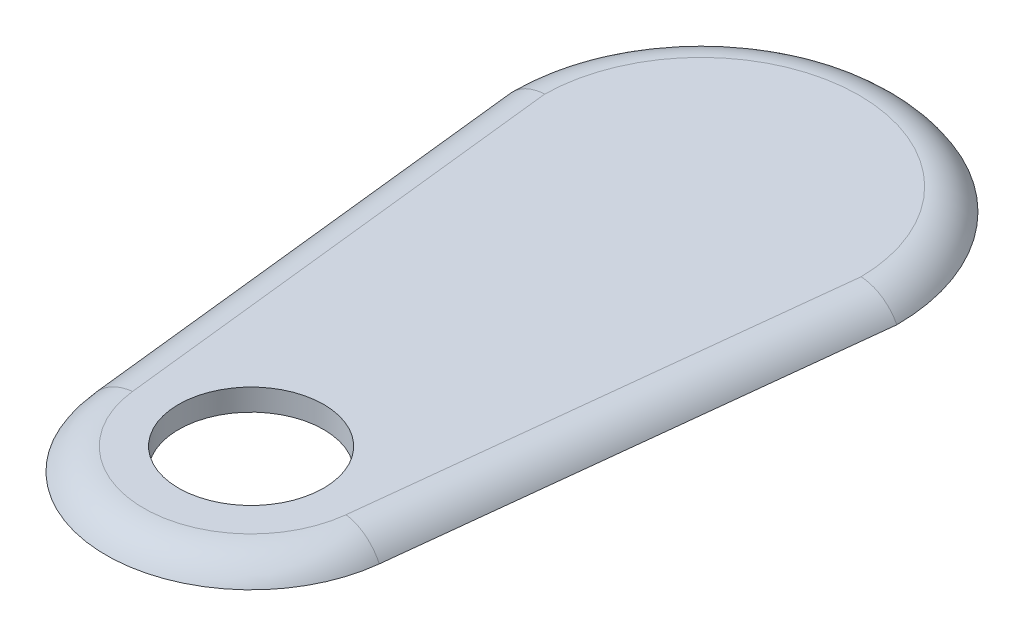
ISO-10303-21;
HEADER;
FILE_DESCRIPTION(('STEP AP214'),'2;1');
FILE_NAME('part.step','',(''),(''),'','','');
FILE_SCHEMA(('AUTOMOTIVE_DESIGN { 1 0 10303 214 1 1 1 1 }'));
ENDSEC;
DATA;
#1=APPLICATION_CONTEXT('core data for automotive mechanical design processes');
#2=APPLICATION_PROTOCOL_DEFINITION('international standard','automotive_design',2000,#1);
#3=PRODUCT_CONTEXT('',#1,'mechanical');
#4=PRODUCT('Part','Part','',(#3));
#5=PRODUCT_RELATED_PRODUCT_CATEGORY('part','',(#4));
#6=PRODUCT_DEFINITION_FORMATION('','',#4);
#7=PRODUCT_DEFINITION_CONTEXT('part definition',#1,'design');
#8=PRODUCT_DEFINITION('design','',#6,#7);
#9=PRODUCT_DEFINITION_SHAPE('','',#8);
#10=(LENGTH_UNIT() NAMED_UNIT(*) SI_UNIT(.MILLI.,.METRE.));
#11=(NAMED_UNIT(*) PLANE_ANGLE_UNIT() SI_UNIT($,.RADIAN.));
#12=(NAMED_UNIT(*) SI_UNIT($,.STERADIAN.) SOLID_ANGLE_UNIT());
#13=UNCERTAINTY_MEASURE_WITH_UNIT(LENGTH_MEASURE(1.E-05),#10,'distance_accuracy_value','');
#14=(GEOMETRIC_REPRESENTATION_CONTEXT(3) GLOBAL_UNCERTAINTY_ASSIGNED_CONTEXT((#13)) GLOBAL_UNIT_ASSIGNED_CONTEXT((#10,
#11,#12)) REPRESENTATION_CONTEXT('',''));
#15=CARTESIAN_POINT('',(0.,0.,0.));
#16=DIRECTION('',(0.,0.,1.));
#17=DIRECTION('',(1.,0.,0.));
#18=AXIS2_PLACEMENT_3D('',#15,#16,#17);
#19=CARTESIAN_POINT('',(0.,48.36,62.));
#20=DIRECTION('',(0.,1.,0.));
#21=DIRECTION('',(0.,0.,1.));
#22=AXIS2_PLACEMENT_3D('',#19,#20,#21);
#23=PLANE('',#22);
#24=CARTESIAN_POINT('',(0.,48.36,62.));
#25=DIRECTION('',(0.,1.,0.));
#26=DIRECTION('',(0.,0.,1.));
#27=AXIS2_PLACEMENT_3D('',#24,#25,#26);
#28=CIRCLE('',#27,10.);
#29=CARTESIAN_POINT('',(0.,48.36,72.));
#30=VERTEX_POINT('',#29);
#31=EDGE_CURVE('E205',#30,#30,#28,.T.);
#32=ORIENTED_EDGE('',*,*,#31,.F.);
#33=EDGE_LOOP('',(#32));
#34=FACE_BOUND('',#33,.T.);
#35=CARTESIAN_POINT('',(0.,48.36,0.));
#36=DIRECTION('',(0.,1.,0.));
#37=DIRECTION('',(0.,0.,1.));
#38=AXIS2_PLACEMENT_3D('',#35,#36,#37);
#39=CIRCLE('',#38,21.8038475772934);
#40=CARTESIAN_POINT('',(21.8021509086281,48.36,-0.272001711845437));
#41=VERTEX_POINT('',#40);
#42=CARTESIAN_POINT('',(-21.8021509086281,48.36,-0.272001711845434));
#43=VERTEX_POINT('',#42);
#44=EDGE_CURVE('E196',#41,#43,#39,.T.);
#45=ORIENTED_EDGE('',*,*,#44,.T.);
#46=DIRECTION('',(0.110244038447533,0.,0.993904548730299));
#47=VECTOR('',#46,1.);
#48=CARTESIAN_POINT('',(-14.7139020952481,48.36,63.632068180364));
#49=LINE('',#48,#47);
#50=CARTESIAN_POINT('',(-14.7139020952481,48.36,63.632068180364));
#51=VERTEX_POINT('',#50);
#52=EDGE_CURVE('E12',#43,#51,#49,.T.);
#53=ORIENTED_EDGE('',*,*,#52,.T.);
#54=CARTESIAN_POINT('',(0.,48.36,62.));
#55=DIRECTION('',(0.,1.,0.));
#56=DIRECTION('',(0.,0.,1.));
#57=AXIS2_PLACEMENT_3D('',#54,#55,#56);
#58=CIRCLE('',#57,14.8041400092644);
#59=CARTESIAN_POINT('',(14.7139020952481,48.36,63.632068180364));
#60=VERTEX_POINT('',#59);
#61=EDGE_CURVE('E136',#51,#60,#58,.T.);
#62=ORIENTED_EDGE('',*,*,#61,.T.);
#63=DIRECTION('',(-0.110244038447533,0.,0.993904548730299));
#64=VECTOR('',#63,1.);
#65=CARTESIAN_POINT('',(21.8355204711759,48.36,-0.572844827468108));
#66=LINE('',#65,#64);
#67=EDGE_CURVE('E184',#60,#41,#66,.F.);
#68=ORIENTED_EDGE('',*,*,#67,.T.);
#69=EDGE_LOOP('',(#45,#53,#62,#68));
#70=FACE_BOUND('',#69,.T.);
#71=ADVANCED_FACE('F120',(#34,#70),#23,.T.);
#72=CARTESIAN_POINT('',(0.,45.36,62.));
#73=DIRECTION('',(0.,1.,0.));
#74=DIRECTION('',(0.,0.,1.));
#75=AXIS2_PLACEMENT_3D('',#72,#73,#74);
#76=PLANE('',#75);
#77=CARTESIAN_POINT('',(0.,45.36,62.));
#78=DIRECTION('',(0.,-1.,0.));
#79=DIRECTION('',(0.,0.,-1.));
#80=AXIS2_PLACEMENT_3D('',#77,#78,#79);
#81=CIRCLE('',#80,10.);
#82=CARTESIAN_POINT('',(0.,45.36,52.));
#83=VERTEX_POINT('',#82);
#84=EDGE_CURVE('E241',#83,#83,#81,.T.);
#85=ORIENTED_EDGE('',*,*,#84,.F.);
#86=EDGE_LOOP('',(#85));
#87=FACE_BOUND('',#86,.T.);
#88=CARTESIAN_POINT('',(0.,45.36,0.));
#89=DIRECTION('',(0.,1.,0.));
#90=DIRECTION('',(0.,0.,1.));
#91=AXIS2_PLACEMENT_3D('',#88,#89,#90);
#92=CIRCLE('',#91,27.);
#93=CARTESIAN_POINT('',(-27.,45.36,0.));
#94=VERTEX_POINT('',#93);
#95=CARTESIAN_POINT('',(27.,45.36,0.));
#96=VERTEX_POINT('',#95);
#97=EDGE_CURVE('E176',#94,#96,#92,.F.);
#98=ORIENTED_EDGE('',*,*,#97,.T.);
#99=DIRECTION('',(-0.110244038447533,0.,0.993904548730299));
#100=VECTOR('',#99,1.);
#101=CARTESIAN_POINT('',(27.,45.36,0.));
#102=LINE('',#101,#100);
#103=CARTESIAN_POINT('',(19.8783816240722,45.36,64.2049130078321));
#104=VERTEX_POINT('',#103);
#105=EDGE_CURVE('E169',#96,#104,#102,.T.);
#106=ORIENTED_EDGE('',*,*,#105,.T.);
#107=CARTESIAN_POINT('',(0.,45.36,62.));
#108=DIRECTION('',(0.,1.,0.));
#109=DIRECTION('',(0.,0.,1.));
#110=AXIS2_PLACEMENT_3D('',#107,#108,#109);
#111=CIRCLE('',#110,20.000292431971);
#112=CARTESIAN_POINT('',(-19.8783816240722,45.36,64.2049130078321));
#113=VERTEX_POINT('',#112);
#114=EDGE_CURVE('E174',#104,#113,#111,.F.);
#115=ORIENTED_EDGE('',*,*,#114,.T.);
#116=DIRECTION('',(-0.110244038447533,0.,-0.993904548730299));
#117=VECTOR('',#116,1.);
#118=CARTESIAN_POINT('',(-19.8783816240722,45.36,64.2049130078321));
#119=LINE('',#118,#117);
#120=EDGE_CURVE('E190',#113,#94,#119,.T.);
#121=ORIENTED_EDGE('',*,*,#120,.T.);
#122=EDGE_LOOP('',(#98,#106,#115,#121));
#123=FACE_BOUND('',#122,.T.);
#124=ADVANCED_FACE('F171',(#87,#123),#76,.F.);
#125=CARTESIAN_POINT('',(21.507369274819,42.36,2.38560055718371));
#126=DIRECTION('',(0.110244038447533,0.,-0.993904548730299));
#127=DIRECTION('',(-0.993904548730299,0.,-0.110244038447533));
#128=AXIS2_PLACEMENT_3D('',#125,#126,#127);
#129=CYLINDRICAL_SURFACE('',#128,6.);
#130=CARTESIAN_POINT('',(14.7139020952478,42.36,63.632068180364));
#131=DIRECTION('',(-0.110244038447534,0.,0.993904548730299));
#132=DIRECTION('',(0.993904548730299,0.,0.110244038447534));
#133=AXIS2_PLACEMENT_3D('',#130,#131,#132);
#134=CIRCLE('',#133,6.);
#135=EDGE_CURVE('E183',#104,#60,#134,.T.);
#136=ORIENTED_EDGE('',*,*,#135,.F.);
#137=ORIENTED_EDGE('',*,*,#105,.F.);
#138=CARTESIAN_POINT('',(27.,45.36,0.));
#139=CARTESIAN_POINT('',(26.9155731788975,45.5062681116153,-0.00466786177312871));
#140=CARTESIAN_POINT('',(26.8249453091061,45.6489419597305,-0.00966788520038721));
#141=CARTESIAN_POINT('',(26.6320088139164,45.9261242338885,-0.0202813095893818));
#142=CARTESIAN_POINT('',(26.5297008678078,46.0606331340919,-0.0258946748795777));
#143=CARTESIAN_POINT('',(26.3142960125904,46.3203083320026,-0.0376745243523639));
#144=CARTESIAN_POINT('',(26.2012174496192,46.4454898912717,-0.0438400669495759));
#145=CARTESIAN_POINT('',(25.9649396882129,46.6858756870136,-0.0566756731212225));
#146=CARTESIAN_POINT('',(25.8417405892044,46.8010800214822,-0.063345731739123));
#147=CARTESIAN_POINT('',(25.5860831467312,47.0207103644204,-0.0771309547996034));
#148=CARTESIAN_POINT('',(25.4536238129487,47.1251352171327,-0.0842461668396783));
#149=CARTESIAN_POINT('',(25.1803552576651,47.3224894527258,-0.0988597682671052));
#150=CARTESIAN_POINT('',(25.0395432885559,47.4154150215338,-0.106358283629091));
#151=CARTESIAN_POINT('',(24.7504827880158,47.5891524179507,-0.121676731937736));
#152=CARTESIAN_POINT('',(24.6022278869866,47.6699536253967,-0.12949693911519));
#153=CARTESIAN_POINT('',(24.2994484243911,47.8187781040728,-0.145384336848053));
#154=CARTESIAN_POINT('',(24.1449236553212,47.8868009519782,-0.153451535575568));
#155=CARTESIAN_POINT('',(23.8173139550125,48.014819625973,-0.17045851305311));
#156=CARTESIAN_POINT('',(23.6437688630185,48.0736391249966,-0.179414110169622));
#157=CARTESIAN_POINT('',(23.2921018075049,48.1751585170467,-0.197442168980412));
#158=CARTESIAN_POINT('',(23.113981527678,48.2178642517586,-0.206514587087979));
#159=CARTESIAN_POINT('',(22.7550321101434,48.2867557774766,-0.224669194492755));
#160=CARTESIAN_POINT('',(22.5742104979362,48.3129809624369,-0.23375130810788));
#161=CARTESIAN_POINT('',(22.2110270711791,48.3488441425111,-0.251857459095944));
#162=CARTESIAN_POINT('',(22.0286666433849,48.3584957413483,-0.260881538036415));
#163=CARTESIAN_POINT('',(21.8316073963548,48.3599459164432,-0.270556827735147));
#164=CARTESIAN_POINT('',(21.8168788246175,48.3600000808968,-0.271279516839045));
#165=CARTESIAN_POINT('',(21.8021509086281,48.36,-0.272001711845448));
#166=B_SPLINE_CURVE_WITH_KNOTS('',3,(#138,#139,#140,#141,#142,#143,#144,#145,#146,#147,#148,
#149,#150,#151,#152,#153,#154,#155,#156,#157,#158,#159,#160,#161,#162,#163,#164,#165),
.UNSPECIFIED.,.F.,.F.,(4,2,2,2,2,2,2,2,2,2,2,2,2,4),(0.,0.506693660079877,1.0133578668755,
1.51917397612304,2.02498511670907,2.53085043328145,3.03688308766119,3.54335643865148,
4.04984656526126,4.59945463979935,5.14886327433335,5.69695359504818,6.24459382371169,
6.28883253477515),.UNSPECIFIED.);
#167=EDGE_CURVE('E125',#41,#96,#166,.F.);
#168=ORIENTED_EDGE('',*,*,#167,.F.);
#169=ORIENTED_EDGE('',*,*,#67,.F.);
#170=EDGE_LOOP('',(#136,#137,#168,#169));
#171=FACE_BOUND('',#170,.T.);
#172=ADVANCED_FACE('F122',(#171),#129,.T.);
#173=CARTESIAN_POINT('',(0.,42.36,0.));
#174=DIRECTION('',(0.,-1.,0.));
#175=DIRECTION('',(0.,0.,-1.));
#176=AXIS2_PLACEMENT_3D('',#173,#174,#175);
#177=TOROIDAL_SURFACE('',#176,21.8038475772934,6.);
#178=ORIENTED_EDGE('',*,*,#167,.T.);
#179=ORIENTED_EDGE('',*,*,#97,.F.);
#180=CARTESIAN_POINT('',(-27.,45.36,0.));
#181=CARTESIAN_POINT('',(-26.9155731788975,45.5062681116153,-0.00466786177315777));
#182=CARTESIAN_POINT('',(-26.8249453091061,45.6489419597305,-0.00966788520040843));
#183=CARTESIAN_POINT('',(-26.6320088139164,45.9261242338885,-0.0202813095893725));
#184=CARTESIAN_POINT('',(-26.5297008678078,46.0606331340919,-0.0258946748795457));
#185=CARTESIAN_POINT('',(-26.3142960125904,46.3203083320026,-0.0376745243523289));
#186=CARTESIAN_POINT('',(-26.2012174496192,46.4454898912717,-0.0438400669495604));
#187=CARTESIAN_POINT('',(-25.9649396882129,46.6858756870136,-0.0566756731212291));
#188=CARTESIAN_POINT('',(-25.8417405892044,46.8010800214822,-0.0633457317391321));
#189=CARTESIAN_POINT('',(-25.5860831467312,47.0207103644204,-0.0771309547995968));
#190=CARTESIAN_POINT('',(-25.4536238129486,47.1251352171327,-0.0842461668396533));
#191=CARTESIAN_POINT('',(-25.1803552576651,47.3224894527258,-0.0988597682670849));
#192=CARTESIAN_POINT('',(-25.0395432885559,47.4154150215338,-0.106358283629093));
#193=CARTESIAN_POINT('',(-24.7504827880158,47.5891524179507,-0.121676731937744));
#194=CARTESIAN_POINT('',(-24.6022278869866,47.6699536253967,-0.129496939115181));
#195=CARTESIAN_POINT('',(-24.2994484243911,47.8187781040728,-0.14538433684804));
#196=CARTESIAN_POINT('',(-24.1449236553212,47.8868009519782,-0.153451535575567));
#197=CARTESIAN_POINT('',(-23.8173139550125,48.014819625973,-0.170458513053154));
#198=CARTESIAN_POINT('',(-23.6437688630185,48.0736391249966,-0.1794141101697));
#199=CARTESIAN_POINT('',(-23.2921018075049,48.1751585170467,-0.197442168980299));
#200=CARTESIAN_POINT('',(-23.113981527678,48.2178642517586,-0.206514587087642));
#201=CARTESIAN_POINT('',(-22.7550321101434,48.2867557774766,-0.224669194493021));
#202=CARTESIAN_POINT('',(-22.5742104979363,48.3129809624369,-0.233751308108972));
#203=CARTESIAN_POINT('',(-22.2110270711791,48.3488441425111,-0.251857459094845));
#204=CARTESIAN_POINT('',(-22.0286666433847,48.3584957413484,-0.260881538032304));
#205=CARTESIAN_POINT('',(-21.8316073963548,48.3599459164432,-0.270556827734503));
#206=CARTESIAN_POINT('',(-21.8168788246175,48.3600000808968,-0.2712795168387));
#207=CARTESIAN_POINT('',(-21.8021509086281,48.36,-0.272001711845447));
#208=B_SPLINE_CURVE_WITH_KNOTS('',3,(#180,#181,#182,#183,#184,#185,#186,#187,#188,#189,#190,
#191,#192,#193,#194,#195,#196,#197,#198,#199,#200,#201,#202,#203,#204,#205,#206,#207),
.UNSPECIFIED.,.F.,.F.,(4,2,2,2,2,2,2,2,2,2,2,2,2,4),(0.,0.506693660079877,1.0133578668755,
1.51917397612304,2.02498511670907,2.53085043328145,3.0368830876612,3.54335643865149,
4.04984656526126,4.59945463979935,5.14886327433335,5.69695359504818,6.24459382371169,
6.28883253477515),.UNSPECIFIED.);
#209=EDGE_CURVE('E187',#43,#94,#208,.F.);
#210=ORIENTED_EDGE('',*,*,#209,.F.);
#211=ORIENTED_EDGE('',*,*,#44,.F.);
#212=EDGE_LOOP('',(#178,#179,#210,#211));
#213=FACE_BOUND('',#212,.T.);
#214=ADVANCED_FACE('F212',(#213),#177,.T.);
#215=CARTESIAN_POINT('',(0.,42.36,62.));
#216=DIRECTION('',(0.,-1.,0.));
#217=DIRECTION('',(0.,0.,-1.));
#218=AXIS2_PLACEMENT_3D('',#215,#216,#217);
#219=TOROIDAL_SURFACE('',#218,14.8041400092644,6.);
#220=ORIENTED_EDGE('',*,*,#135,.T.);
#221=ORIENTED_EDGE('',*,*,#61,.F.);
#222=CARTESIAN_POINT('',(-14.7139020952478,42.36,63.632068180364));
#223=DIRECTION('',(-0.110244038447532,0.,-0.993904548730299));
#224=DIRECTION('',(-0.993904548730299,0.,0.110244038447532));
#225=AXIS2_PLACEMENT_3D('',#222,#223,#224);
#226=CIRCLE('',#225,6.);
#227=EDGE_CURVE('E144',#113,#51,#226,.T.);
#228=ORIENTED_EDGE('',*,*,#227,.F.);
#229=ORIENTED_EDGE('',*,*,#114,.F.);
#230=EDGE_LOOP('',(#220,#221,#228,#229));
#231=FACE_BOUND('',#230,.T.);
#232=ADVANCED_FACE('F188',(#231),#219,.T.);
#233=CARTESIAN_POINT('',(-21.507369274819,42.36,2.38560055718371));
#234=DIRECTION('',(-0.110244038447533,0.,-0.993904548730299));
#235=DIRECTION('',(-0.993904548730299,0.,0.110244038447533));
#236=AXIS2_PLACEMENT_3D('',#233,#234,#235);
#237=CYLINDRICAL_SURFACE('',#236,6.);
#238=ORIENTED_EDGE('',*,*,#209,.T.);
#239=ORIENTED_EDGE('',*,*,#120,.F.);
#240=ORIENTED_EDGE('',*,*,#227,.T.);
#241=ORIENTED_EDGE('',*,*,#52,.F.);
#242=EDGE_LOOP('',(#238,#239,#240,#241));
#243=FACE_BOUND('',#242,.T.);
#244=ADVANCED_FACE('F215',(#243),#237,.T.);
#245=CARTESIAN_POINT('',(0.,130.36,62.));
#246=DIRECTION('',(0.,-1.,0.));
#247=DIRECTION('',(0.,0.,-1.));
#248=AXIS2_PLACEMENT_3D('',#245,#246,#247);
#249=CYLINDRICAL_SURFACE('',#248,10.);
#250=ORIENTED_EDGE('',*,*,#31,.T.);
#251=EDGE_LOOP('',(#250));
#252=FACE_BOUND('',#251,.T.);
#253=ORIENTED_EDGE('',*,*,#84,.T.);
#254=EDGE_LOOP('',(#253));
#255=FACE_BOUND('',#254,.T.);
#256=ADVANCED_FACE('F218',(#252,#255),#249,.F.);
#257=CLOSED_SHELL('',(#71,#124,#172,#214,#232,#244,#256));
#258=MANIFOLD_SOLID_BREP('B2',#257);
#259=ADVANCED_BREP_SHAPE_REPRESENTATION('',(#18,#258),#14);
#260=SHAPE_DEFINITION_REPRESENTATION(#9,#259);
ENDSEC;
END-ISO-10303-21;
